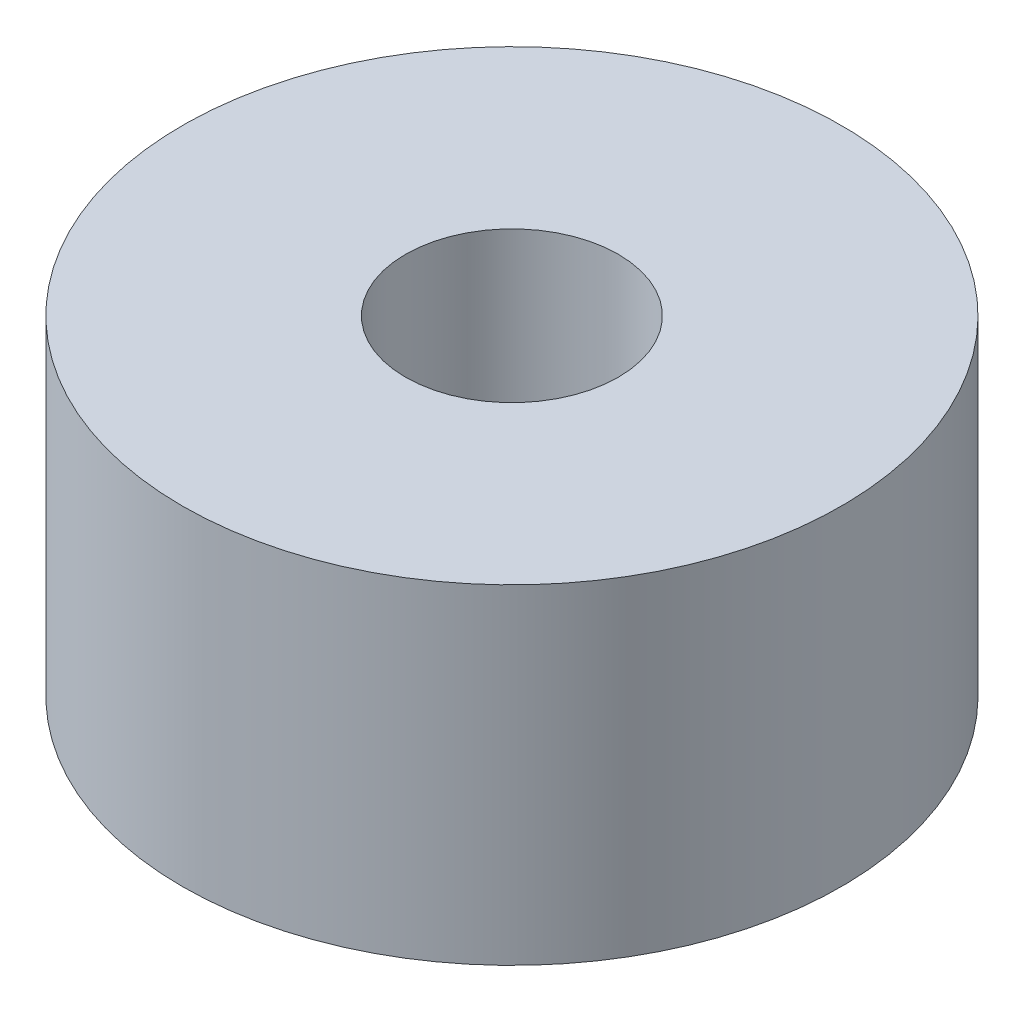
ISO-10303-21;
HEADER;
FILE_DESCRIPTION(('STEP AP214'),'2;1');
FILE_NAME('part.step','',(''),(''),'','','');
FILE_SCHEMA(('AUTOMOTIVE_DESIGN { 1 0 10303 214 1 1 1 1 }'));
ENDSEC;
DATA;
#1=APPLICATION_CONTEXT('core data for automotive mechanical design processes');
#2=APPLICATION_PROTOCOL_DEFINITION('international standard','automotive_design',2000,#1);
#3=PRODUCT_CONTEXT('',#1,'mechanical');
#4=PRODUCT('Part','Part','',(#3));
#5=PRODUCT_RELATED_PRODUCT_CATEGORY('part','',(#4));
#6=PRODUCT_DEFINITION_FORMATION('','',#4);
#7=PRODUCT_DEFINITION_CONTEXT('part definition',#1,'design');
#8=PRODUCT_DEFINITION('design','',#6,#7);
#9=PRODUCT_DEFINITION_SHAPE('','',#8);
#10=(LENGTH_UNIT() NAMED_UNIT(*) SI_UNIT(.MILLI.,.METRE.));
#11=(NAMED_UNIT(*) PLANE_ANGLE_UNIT() SI_UNIT($,.RADIAN.));
#12=(NAMED_UNIT(*) SI_UNIT($,.STERADIAN.) SOLID_ANGLE_UNIT());
#13=UNCERTAINTY_MEASURE_WITH_UNIT(LENGTH_MEASURE(1.E-05),#10,'distance_accuracy_value','');
#14=(GEOMETRIC_REPRESENTATION_CONTEXT(3) GLOBAL_UNCERTAINTY_ASSIGNED_CONTEXT((#13)) GLOBAL_UNIT_ASSIGNED_CONTEXT((#10,
#11,#12)) REPRESENTATION_CONTEXT('',''));
#15=CARTESIAN_POINT('',(0.,0.,0.));
#16=DIRECTION('',(0.,0.,1.));
#17=DIRECTION('',(1.,0.,0.));
#18=AXIS2_PLACEMENT_3D('',#15,#16,#17);
#19=CARTESIAN_POINT('',(0.,12.7,0.));
#20=DIRECTION('',(0.,1.,0.));
#21=DIRECTION('',(0.,0.,1.));
#22=AXIS2_PLACEMENT_3D('',#19,#20,#21);
#23=PLANE('',#22);
#24=CARTESIAN_POINT('',(0.,12.7,0.));
#25=DIRECTION('',(0.,1.,0.));
#26=DIRECTION('',(0.,0.,1.));
#27=AXIS2_PLACEMENT_3D('',#24,#25,#26);
#28=CIRCLE('',#27,12.7);
#29=CARTESIAN_POINT('',(0.,12.7,12.7));
#30=VERTEX_POINT('',#29);
#31=EDGE_CURVE('E10',#30,#30,#28,.T.);
#32=ORIENTED_EDGE('',*,*,#31,.T.);
#33=EDGE_LOOP('',(#32));
#34=FACE_BOUND('',#33,.T.);
#35=CARTESIAN_POINT('',(0.,12.7,0.));
#36=DIRECTION('',(0.,1.,0.));
#37=DIRECTION('',(0.,0.,1.));
#38=AXIS2_PLACEMENT_3D('',#35,#36,#37);
#39=CIRCLE('',#38,4.1021);
#40=CARTESIAN_POINT('',(0.,12.7,4.1021));
#41=VERTEX_POINT('',#40);
#42=EDGE_CURVE('E42',#41,#41,#39,.T.);
#43=ORIENTED_EDGE('',*,*,#42,.F.);
#44=EDGE_LOOP('',(#43));
#45=FACE_BOUND('',#44,.T.);
#46=ADVANCED_FACE('F31',(#34,#45),#23,.T.);
#47=CARTESIAN_POINT('',(0.,0.,0.));
#48=DIRECTION('',(0.,1.,0.));
#49=DIRECTION('',(0.,0.,1.));
#50=AXIS2_PLACEMENT_3D('',#47,#48,#49);
#51=PLANE('',#50);
#52=CARTESIAN_POINT('',(0.,0.,0.));
#53=DIRECTION('',(0.,1.,0.));
#54=DIRECTION('',(0.,0.,1.));
#55=AXIS2_PLACEMENT_3D('',#52,#53,#54);
#56=CIRCLE('',#55,12.7);
#57=CARTESIAN_POINT('',(0.,0.,12.7));
#58=VERTEX_POINT('',#57);
#59=EDGE_CURVE('E35',#58,#58,#56,.T.);
#60=ORIENTED_EDGE('',*,*,#59,.F.);
#61=EDGE_LOOP('',(#60));
#62=FACE_BOUND('',#61,.T.);
#63=CARTESIAN_POINT('',(0.,0.,0.));
#64=DIRECTION('',(0.,1.,0.));
#65=DIRECTION('',(0.,0.,1.));
#66=AXIS2_PLACEMENT_3D('',#63,#64,#65);
#67=CIRCLE('',#66,4.1021);
#68=CARTESIAN_POINT('',(0.,0.,4.1021));
#69=VERTEX_POINT('',#68);
#70=EDGE_CURVE('E44',#69,#69,#67,.T.);
#71=ORIENTED_EDGE('',*,*,#70,.T.);
#72=EDGE_LOOP('',(#71));
#73=FACE_BOUND('',#72,.T.);
#74=ADVANCED_FACE('F54',(#62,#73),#51,.F.);
#75=CARTESIAN_POINT('',(0.,12.7,0.));
#76=DIRECTION('',(0.,-1.,0.));
#77=DIRECTION('',(0.,0.,-1.));
#78=AXIS2_PLACEMENT_3D('',#75,#76,#77);
#79=CYLINDRICAL_SURFACE('',#78,12.7);
#80=ORIENTED_EDGE('',*,*,#31,.F.);
#81=EDGE_LOOP('',(#80));
#82=FACE_BOUND('',#81,.T.);
#83=ORIENTED_EDGE('',*,*,#59,.T.);
#84=EDGE_LOOP('',(#83));
#85=FACE_BOUND('',#84,.T.);
#86=ADVANCED_FACE('F33',(#82,#85),#79,.T.);
#87=CARTESIAN_POINT('',(0.,12.7,0.));
#88=DIRECTION('',(0.,-1.,0.));
#89=DIRECTION('',(0.,0.,-1.));
#90=AXIS2_PLACEMENT_3D('',#87,#88,#89);
#91=CYLINDRICAL_SURFACE('',#90,4.1021);
#92=ORIENTED_EDGE('',*,*,#42,.T.);
#93=EDGE_LOOP('',(#92));
#94=FACE_BOUND('',#93,.T.);
#95=ORIENTED_EDGE('',*,*,#70,.F.);
#96=EDGE_LOOP('',(#95));
#97=FACE_BOUND('',#96,.T.);
#98=ADVANCED_FACE('F50',(#94,#97),#91,.F.);
#99=CLOSED_SHELL('',(#46,#74,#86,#98));
#100=MANIFOLD_SOLID_BREP('B2',#99);
#101=ADVANCED_BREP_SHAPE_REPRESENTATION('',(#18,#100),#14);
#102=SHAPE_DEFINITION_REPRESENTATION(#9,#101);
ENDSEC;
END-ISO-10303-21;
